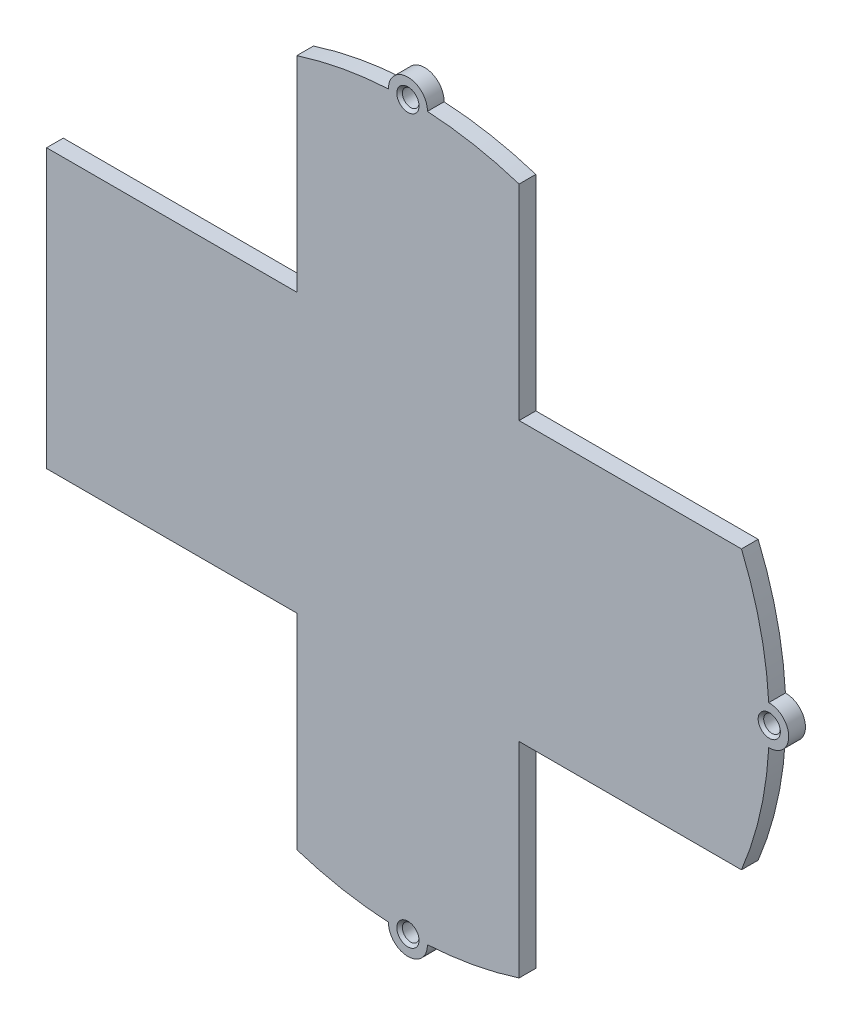
ISO-10303-21;
HEADER;
FILE_DESCRIPTION(('STEP AP214'),'2;1');
FILE_NAME('part.step','',(''),(''),'','','');
FILE_SCHEMA(('AUTOMOTIVE_DESIGN { 1 0 10303 214 1 1 1 1 }'));
ENDSEC;
DATA;
#1=APPLICATION_CONTEXT('core data for automotive mechanical design processes');
#2=APPLICATION_PROTOCOL_DEFINITION('international standard','automotive_design',2000,#1);
#3=PRODUCT_CONTEXT('',#1,'mechanical');
#4=PRODUCT('Part','Part','',(#3));
#5=PRODUCT_RELATED_PRODUCT_CATEGORY('part','',(#4));
#6=PRODUCT_DEFINITION_FORMATION('','',#4);
#7=PRODUCT_DEFINITION_CONTEXT('part definition',#1,'design');
#8=PRODUCT_DEFINITION('design','',#6,#7);
#9=PRODUCT_DEFINITION_SHAPE('','',#8);
#10=(LENGTH_UNIT() NAMED_UNIT(*) SI_UNIT(.MILLI.,.METRE.));
#11=(NAMED_UNIT(*) PLANE_ANGLE_UNIT() SI_UNIT($,.RADIAN.));
#12=(NAMED_UNIT(*) SI_UNIT($,.STERADIAN.) SOLID_ANGLE_UNIT());
#13=UNCERTAINTY_MEASURE_WITH_UNIT(LENGTH_MEASURE(1.E-05),#10,'distance_accuracy_value','');
#14=(GEOMETRIC_REPRESENTATION_CONTEXT(3) GLOBAL_UNCERTAINTY_ASSIGNED_CONTEXT((#13)) GLOBAL_UNIT_ASSIGNED_CONTEXT((#10,
#11,#12)) REPRESENTATION_CONTEXT('',''));
#15=CARTESIAN_POINT('',(0.,0.,0.));
#16=DIRECTION('',(0.,0.,1.));
#17=DIRECTION('',(1.,0.,0.));
#18=AXIS2_PLACEMENT_3D('',#15,#16,#17);
#19=CARTESIAN_POINT('',(0.,0.,3.));
#20=DIRECTION('',(0.,0.,-1.));
#21=DIRECTION('',(-1.,0.,0.));
#22=AXIS2_PLACEMENT_3D('',#19,#20,#21);
#23=CYLINDRICAL_SURFACE('',#22,65.);
#24=CARTESIAN_POINT('',(0.,0.,0.));
#25=DIRECTION('',(0.,0.,1.));
#26=DIRECTION('',(1.,0.,0.));
#27=AXIS2_PLACEMENT_3D('',#24,#25,#26);
#28=CIRCLE('',#27,65.);
#29=CARTESIAN_POINT('',(-20.,-61.8465843842649,0.));
#30=VERTEX_POINT('',#29);
#31=CARTESIAN_POINT('',(-3.4987312789253,-64.9057692307692,0.));
#32=VERTEX_POINT('',#31);
#33=EDGE_CURVE('E264',#30,#32,#28,.T.);
#34=ORIENTED_EDGE('',*,*,#33,.T.);
#35=DIRECTION('',(0.,0.,1.));
#36=VECTOR('',#35,1.);
#37=CARTESIAN_POINT('',(-3.4987312789253,-64.9057692307692,1.5));
#38=LINE('',#37,#36);
#39=CARTESIAN_POINT('',(-3.4987312789253,-64.9057692307692,3.));
#40=VERTEX_POINT('',#39);
#41=EDGE_CURVE('E214',#32,#40,#38,.T.);
#42=ORIENTED_EDGE('',*,*,#41,.T.);
#43=CARTESIAN_POINT('',(0.,0.,3.));
#44=DIRECTION('',(0.,0.,1.));
#45=DIRECTION('',(1.,0.,0.));
#46=AXIS2_PLACEMENT_3D('',#43,#44,#45);
#47=CIRCLE('',#46,65.);
#48=CARTESIAN_POINT('',(-20.,-61.8465843842649,3.));
#49=VERTEX_POINT('',#48);
#50=EDGE_CURVE('E242',#49,#40,#47,.T.);
#51=ORIENTED_EDGE('',*,*,#50,.F.);
#52=DIRECTION('',(0.,0.,-1.));
#53=VECTOR('',#52,1.);
#54=CARTESIAN_POINT('',(-20.,-61.8465843842649,3.));
#55=LINE('',#54,#53);
#56=EDGE_CURVE('E308',#49,#30,#55,.T.);
#57=ORIENTED_EDGE('',*,*,#56,.T.);
#58=EDGE_LOOP('',(#34,#42,#51,#57));
#59=FACE_BOUND('',#58,.T.);
#60=ADVANCED_FACE('F45',(#59),#23,.T.);
#61=CARTESIAN_POINT('',(0.,0.,3.));
#62=DIRECTION('',(0.,0.,-1.));
#63=DIRECTION('',(-1.,0.,0.));
#64=AXIS2_PLACEMENT_3D('',#61,#62,#63);
#65=CYLINDRICAL_SURFACE('',#64,65.);
#66=CARTESIAN_POINT('',(0.,0.,0.));
#67=DIRECTION('',(0.,0.,1.));
#68=DIRECTION('',(1.,0.,0.));
#69=AXIS2_PLACEMENT_3D('',#66,#67,#68);
#70=CIRCLE('',#69,65.);
#71=CARTESIAN_POINT('',(20.,61.8465843842649,0.));
#72=VERTEX_POINT('',#71);
#73=CARTESIAN_POINT('',(3.49873127892529,64.9057692307692,0.));
#74=VERTEX_POINT('',#73);
#75=EDGE_CURVE('E280',#72,#74,#70,.T.);
#76=ORIENTED_EDGE('',*,*,#75,.T.);
#77=DIRECTION('',(0.,0.,1.));
#78=VECTOR('',#77,1.);
#79=CARTESIAN_POINT('',(3.49873127892529,64.9057692307692,1.5));
#80=LINE('',#79,#78);
#81=CARTESIAN_POINT('',(3.49873127892529,64.9057692307692,3.));
#82=VERTEX_POINT('',#81);
#83=EDGE_CURVE('E223',#74,#82,#80,.T.);
#84=ORIENTED_EDGE('',*,*,#83,.T.);
#85=CARTESIAN_POINT('',(0.,0.,3.));
#86=DIRECTION('',(0.,0.,1.));
#87=DIRECTION('',(1.,0.,0.));
#88=AXIS2_PLACEMENT_3D('',#85,#86,#87);
#89=CIRCLE('',#88,65.);
#90=CARTESIAN_POINT('',(20.,61.8465843842649,3.));
#91=VERTEX_POINT('',#90);
#92=EDGE_CURVE('E257',#91,#82,#89,.T.);
#93=ORIENTED_EDGE('',*,*,#92,.F.);
#94=DIRECTION('',(0.,0.,-1.));
#95=VECTOR('',#94,1.);
#96=CARTESIAN_POINT('',(20.,61.8465843842649,3.));
#97=LINE('',#96,#95);
#98=EDGE_CURVE('E290',#91,#72,#97,.T.);
#99=ORIENTED_EDGE('',*,*,#98,.T.);
#100=EDGE_LOOP('',(#76,#84,#93,#99));
#101=FACE_BOUND('',#100,.T.);
#102=ADVANCED_FACE('F346',(#101),#65,.T.);
#103=CARTESIAN_POINT('',(0.,0.,3.));
#104=DIRECTION('',(0.,0.,-1.));
#105=DIRECTION('',(-1.,0.,0.));
#106=AXIS2_PLACEMENT_3D('',#103,#104,#105);
#107=CYLINDRICAL_SURFACE('',#106,65.);
#108=CARTESIAN_POINT('',(0.,0.,0.));
#109=DIRECTION('',(0.,0.,1.));
#110=DIRECTION('',(1.,0.,0.));
#111=AXIS2_PLACEMENT_3D('',#108,#109,#110);
#112=CIRCLE('',#111,65.);
#113=CARTESIAN_POINT('',(60.,-25.,0.));
#114=VERTEX_POINT('',#113);
#115=CARTESIAN_POINT('',(64.9057692307692,-3.49873127892529,0.));
#116=VERTEX_POINT('',#115);
#117=EDGE_CURVE('E272',#114,#116,#112,.T.);
#118=ORIENTED_EDGE('',*,*,#117,.T.);
#119=DIRECTION('',(0.,0.,1.));
#120=VECTOR('',#119,1.);
#121=CARTESIAN_POINT('',(64.9057692307692,-3.49873127892529,1.5));
#122=LINE('',#121,#120);
#123=CARTESIAN_POINT('',(64.9057692307692,-3.49873127892529,3.));
#124=VERTEX_POINT('',#123);
#125=EDGE_CURVE('E233',#116,#124,#122,.T.);
#126=ORIENTED_EDGE('',*,*,#125,.T.);
#127=CARTESIAN_POINT('',(0.,0.,3.));
#128=DIRECTION('',(0.,0.,1.));
#129=DIRECTION('',(1.,0.,0.));
#130=AXIS2_PLACEMENT_3D('',#127,#128,#129);
#131=CIRCLE('',#130,65.);
#132=CARTESIAN_POINT('',(60.,-25.,3.));
#133=VERTEX_POINT('',#132);
#134=EDGE_CURVE('E249',#133,#124,#131,.T.);
#135=ORIENTED_EDGE('',*,*,#134,.F.);
#136=DIRECTION('',(0.,0.,-1.));
#137=VECTOR('',#136,1.);
#138=CARTESIAN_POINT('',(60.,-25.,3.));
#139=LINE('',#138,#137);
#140=EDGE_CURVE('E299',#133,#114,#139,.T.);
#141=ORIENTED_EDGE('',*,*,#140,.T.);
#142=EDGE_LOOP('',(#118,#126,#135,#141));
#143=FACE_BOUND('',#142,.T.);
#144=ADVANCED_FACE('F354',(#143),#107,.T.);
#145=CARTESIAN_POINT('',(-60.,-25.,3.));
#146=DIRECTION('',(0.,1.,0.));
#147=DIRECTION('',(0.,0.,1.));
#148=AXIS2_PLACEMENT_3D('',#145,#146,#147);
#149=PLANE('',#148);
#150=DIRECTION('',(1.,0.,0.));
#151=VECTOR('',#150,1.);
#152=CARTESIAN_POINT('',(-60.,-25.,0.));
#153=LINE('',#152,#151);
#154=CARTESIAN_POINT('',(-65.,-25.,0.));
#155=VERTEX_POINT('',#154);
#156=CARTESIAN_POINT('',(-20.,-25.,0.));
#157=VERTEX_POINT('',#156);
#158=EDGE_CURVE('E236',#155,#157,#153,.T.);
#159=ORIENTED_EDGE('',*,*,#158,.T.);
#160=DIRECTION('',(0.,0.,-1.));
#161=VECTOR('',#160,1.);
#162=CARTESIAN_POINT('',(-20.,-25.,3.));
#163=LINE('',#162,#161);
#164=CARTESIAN_POINT('',(-20.,-25.,3.));
#165=VERTEX_POINT('',#164);
#166=EDGE_CURVE('E311',#165,#157,#163,.T.);
#167=ORIENTED_EDGE('',*,*,#166,.F.);
#168=DIRECTION('',(1.,0.,0.));
#169=VECTOR('',#168,1.);
#170=CARTESIAN_POINT('',(-60.,-25.,3.));
#171=LINE('',#170,#169);
#172=CARTESIAN_POINT('',(-65.,-25.,3.));
#173=VERTEX_POINT('',#172);
#174=EDGE_CURVE('E237',#173,#165,#171,.T.);
#175=ORIENTED_EDGE('',*,*,#174,.F.);
#176=DIRECTION('',(0.,0.,1.));
#177=VECTOR('',#176,1.);
#178=CARTESIAN_POINT('',(-65.,-25.,0.));
#179=LINE('',#178,#177);
#180=EDGE_CURVE('E188',#155,#173,#179,.T.);
#181=ORIENTED_EDGE('',*,*,#180,.F.);
#182=EDGE_LOOP('',(#159,#167,#175,#181));
#183=FACE_BOUND('',#182,.T.);
#184=ADVANCED_FACE('F372',(#183),#149,.F.);
#185=CARTESIAN_POINT('',(-20.,-25.,3.));
#186=DIRECTION('',(1.,0.,0.));
#187=DIRECTION('',(0.,0.,-1.));
#188=AXIS2_PLACEMENT_3D('',#185,#186,#187);
#189=PLANE('',#188);
#190=DIRECTION('',(0.,-1.,0.));
#191=VECTOR('',#190,1.);
#192=CARTESIAN_POINT('',(-20.,-25.,0.));
#193=LINE('',#192,#191);
#194=EDGE_CURVE('E261',#157,#30,#193,.T.);
#195=ORIENTED_EDGE('',*,*,#194,.T.);
#196=ORIENTED_EDGE('',*,*,#56,.F.);
#197=DIRECTION('',(0.,-1.,0.));
#198=VECTOR('',#197,1.);
#199=CARTESIAN_POINT('',(-20.,-25.,3.));
#200=LINE('',#199,#198);
#201=EDGE_CURVE('E239',#165,#49,#200,.T.);
#202=ORIENTED_EDGE('',*,*,#201,.F.);
#203=ORIENTED_EDGE('',*,*,#166,.T.);
#204=EDGE_LOOP('',(#195,#196,#202,#203));
#205=FACE_BOUND('',#204,.T.);
#206=ADVANCED_FACE('F362',(#205),#189,.F.);
#207=CARTESIAN_POINT('',(3.49873127892516,-64.9057692307692,3.));
#208=VERTEX_POINT('',#207);
#209=CARTESIAN_POINT('',(20.,-61.8465843842649,3.));
#210=VERTEX_POINT('',#209);
#211=EDGE_CURVE('E241',#208,#210,#47,.T.);
#212=ORIENTED_EDGE('',*,*,#211,.F.);
#213=DIRECTION('',(0.,0.,1.));
#214=VECTOR('',#213,1.);
#215=CARTESIAN_POINT('',(3.49873127892528,-64.9057692307692,1.5));
#216=LINE('',#215,#214);
#217=CARTESIAN_POINT('',(3.49873127892528,-64.9057692307692,0.));
#218=VERTEX_POINT('',#217);
#219=EDGE_CURVE('E210',#208,#218,#216,.F.);
#220=ORIENTED_EDGE('',*,*,#219,.T.);
#221=CARTESIAN_POINT('',(20.,-61.8465843842649,0.));
#222=VERTEX_POINT('',#221);
#223=EDGE_CURVE('E263',#218,#222,#28,.T.);
#224=ORIENTED_EDGE('',*,*,#223,.T.);
#225=DIRECTION('',(0.,0.,-1.));
#226=VECTOR('',#225,1.);
#227=CARTESIAN_POINT('',(20.,-61.8465843842649,3.));
#228=LINE('',#227,#226);
#229=EDGE_CURVE('E305',#210,#222,#228,.T.);
#230=ORIENTED_EDGE('',*,*,#229,.F.);
#231=EDGE_LOOP('',(#212,#220,#224,#230));
#232=FACE_BOUND('',#231,.T.);
#233=ADVANCED_FACE('F349',(#232),#23,.T.);
#234=CARTESIAN_POINT('',(20.,-25.,3.));
#235=DIRECTION('',(-1.,0.,0.));
#236=DIRECTION('',(0.,-1.,0.));
#237=AXIS2_PLACEMENT_3D('',#234,#235,#236);
#238=PLANE('',#237);
#239=DIRECTION('',(0.,1.,0.));
#240=VECTOR('',#239,1.);
#241=CARTESIAN_POINT('',(20.,-25.,0.));
#242=LINE('',#241,#240);
#243=CARTESIAN_POINT('',(20.,-25.,0.));
#244=VERTEX_POINT('',#243);
#245=EDGE_CURVE('E267',#222,#244,#242,.T.);
#246=ORIENTED_EDGE('',*,*,#245,.T.);
#247=DIRECTION('',(0.,0.,-1.));
#248=VECTOR('',#247,1.);
#249=CARTESIAN_POINT('',(20.,-25.,3.));
#250=LINE('',#249,#248);
#251=CARTESIAN_POINT('',(20.,-25.,3.));
#252=VERTEX_POINT('',#251);
#253=EDGE_CURVE('E302',#252,#244,#250,.T.);
#254=ORIENTED_EDGE('',*,*,#253,.F.);
#255=DIRECTION('',(0.,1.,0.));
#256=VECTOR('',#255,1.);
#257=CARTESIAN_POINT('',(20.,-25.,3.));
#258=LINE('',#257,#256);
#259=EDGE_CURVE('E244',#210,#252,#258,.T.);
#260=ORIENTED_EDGE('',*,*,#259,.F.);
#261=ORIENTED_EDGE('',*,*,#229,.T.);
#262=EDGE_LOOP('',(#246,#254,#260,#261));
#263=FACE_BOUND('',#262,.T.);
#264=ADVANCED_FACE('F361',(#263),#238,.F.);
#265=CARTESIAN_POINT('',(20.,-25.,3.));
#266=DIRECTION('',(0.,1.,0.));
#267=DIRECTION('',(0.,0.,1.));
#268=AXIS2_PLACEMENT_3D('',#265,#266,#267);
#269=PLANE('',#268);
#270=DIRECTION('',(1.,0.,0.));
#271=VECTOR('',#270,1.);
#272=CARTESIAN_POINT('',(20.,-25.,0.));
#273=LINE('',#272,#271);
#274=EDGE_CURVE('E269',#244,#114,#273,.T.);
#275=ORIENTED_EDGE('',*,*,#274,.T.);
#276=ORIENTED_EDGE('',*,*,#140,.F.);
#277=DIRECTION('',(1.,0.,0.));
#278=VECTOR('',#277,1.);
#279=CARTESIAN_POINT('',(20.,-25.,3.));
#280=LINE('',#279,#278);
#281=EDGE_CURVE('E246',#252,#133,#280,.T.);
#282=ORIENTED_EDGE('',*,*,#281,.F.);
#283=ORIENTED_EDGE('',*,*,#253,.T.);
#284=EDGE_LOOP('',(#275,#276,#282,#283));
#285=FACE_BOUND('',#284,.T.);
#286=ADVANCED_FACE('F369',(#285),#269,.F.);
#287=CARTESIAN_POINT('',(64.9057692307692,3.49873127892542,3.));
#288=VERTEX_POINT('',#287);
#289=CARTESIAN_POINT('',(60.,25.,3.));
#290=VERTEX_POINT('',#289);
#291=EDGE_CURVE('E248',#288,#290,#131,.T.);
#292=ORIENTED_EDGE('',*,*,#291,.F.);
#293=DIRECTION('',(0.,0.,1.));
#294=VECTOR('',#293,1.);
#295=CARTESIAN_POINT('',(64.9057692307692,3.49873127892529,1.5));
#296=LINE('',#295,#294);
#297=CARTESIAN_POINT('',(64.9057692307692,3.49873127892529,0.));
#298=VERTEX_POINT('',#297);
#299=EDGE_CURVE('E229',#288,#298,#296,.F.);
#300=ORIENTED_EDGE('',*,*,#299,.T.);
#301=CARTESIAN_POINT('',(60.,25.,0.));
#302=VERTEX_POINT('',#301);
#303=EDGE_CURVE('E271',#298,#302,#112,.T.);
#304=ORIENTED_EDGE('',*,*,#303,.T.);
#305=DIRECTION('',(0.,0.,-1.));
#306=VECTOR('',#305,1.);
#307=CARTESIAN_POINT('',(60.,25.,3.));
#308=LINE('',#307,#306);
#309=EDGE_CURVE('E296',#290,#302,#308,.T.);
#310=ORIENTED_EDGE('',*,*,#309,.F.);
#311=EDGE_LOOP('',(#292,#300,#304,#310));
#312=FACE_BOUND('',#311,.T.);
#313=ADVANCED_FACE('F395',(#312),#107,.T.);
#314=CARTESIAN_POINT('',(20.,25.,3.));
#315=DIRECTION('',(0.,-1.,0.));
#316=DIRECTION('',(1.,0.,0.));
#317=AXIS2_PLACEMENT_3D('',#314,#315,#316);
#318=PLANE('',#317);
#319=DIRECTION('',(-1.,0.,0.));
#320=VECTOR('',#319,1.);
#321=CARTESIAN_POINT('',(20.,25.,0.));
#322=LINE('',#321,#320);
#323=CARTESIAN_POINT('',(20.,25.,0.));
#324=VERTEX_POINT('',#323);
#325=EDGE_CURVE('E275',#302,#324,#322,.T.);
#326=ORIENTED_EDGE('',*,*,#325,.T.);
#327=DIRECTION('',(0.,0.,-1.));
#328=VECTOR('',#327,1.);
#329=CARTESIAN_POINT('',(20.,25.,3.));
#330=LINE('',#329,#328);
#331=CARTESIAN_POINT('',(20.,25.,3.));
#332=VERTEX_POINT('',#331);
#333=EDGE_CURVE('E293',#332,#324,#330,.T.);
#334=ORIENTED_EDGE('',*,*,#333,.F.);
#335=DIRECTION('',(-1.,0.,0.));
#336=VECTOR('',#335,1.);
#337=CARTESIAN_POINT('',(20.,25.,3.));
#338=LINE('',#337,#336);
#339=EDGE_CURVE('E252',#290,#332,#338,.T.);
#340=ORIENTED_EDGE('',*,*,#339,.F.);
#341=ORIENTED_EDGE('',*,*,#309,.T.);
#342=EDGE_LOOP('',(#326,#334,#340,#341));
#343=FACE_BOUND('',#342,.T.);
#344=ADVANCED_FACE('F400',(#343),#318,.F.);
#345=CARTESIAN_POINT('',(20.,61.8465843842649,3.));
#346=DIRECTION('',(-1.,0.,0.));
#347=DIRECTION('',(0.,-1.,0.));
#348=AXIS2_PLACEMENT_3D('',#345,#346,#347);
#349=PLANE('',#348);
#350=DIRECTION('',(0.,1.,0.));
#351=VECTOR('',#350,1.);
#352=CARTESIAN_POINT('',(20.,61.8465843842649,0.));
#353=LINE('',#352,#351);
#354=EDGE_CURVE('E277',#324,#72,#353,.T.);
#355=ORIENTED_EDGE('',*,*,#354,.T.);
#356=ORIENTED_EDGE('',*,*,#98,.F.);
#357=DIRECTION('',(0.,1.,0.));
#358=VECTOR('',#357,1.);
#359=CARTESIAN_POINT('',(20.,61.8465843842649,3.));
#360=LINE('',#359,#358);
#361=EDGE_CURVE('E254',#332,#91,#360,.T.);
#362=ORIENTED_EDGE('',*,*,#361,.F.);
#363=ORIENTED_EDGE('',*,*,#333,.T.);
#364=EDGE_LOOP('',(#355,#356,#362,#363));
#365=FACE_BOUND('',#364,.T.);
#366=ADVANCED_FACE('F405',(#365),#349,.F.);
#367=CARTESIAN_POINT('',(-3.49873127892517,64.9057692307692,3.));
#368=VERTEX_POINT('',#367);
#369=CARTESIAN_POINT('',(-20.,61.8465843842649,3.));
#370=VERTEX_POINT('',#369);
#371=EDGE_CURVE('E256',#368,#370,#89,.T.);
#372=ORIENTED_EDGE('',*,*,#371,.F.);
#373=DIRECTION('',(0.,0.,1.));
#374=VECTOR('',#373,1.);
#375=CARTESIAN_POINT('',(-3.49873127892528,64.9057692307692,1.5));
#376=LINE('',#375,#374);
#377=CARTESIAN_POINT('',(-3.49873127892528,64.9057692307692,0.));
#378=VERTEX_POINT('',#377);
#379=EDGE_CURVE('E219',#368,#378,#376,.F.);
#380=ORIENTED_EDGE('',*,*,#379,.T.);
#381=CARTESIAN_POINT('',(-20.,61.8465843842649,0.));
#382=VERTEX_POINT('',#381);
#383=EDGE_CURVE('E279',#378,#382,#70,.T.);
#384=ORIENTED_EDGE('',*,*,#383,.T.);
#385=DIRECTION('',(0.,0.,-1.));
#386=VECTOR('',#385,1.);
#387=CARTESIAN_POINT('',(-20.,61.8465843842649,3.));
#388=LINE('',#387,#386);
#389=EDGE_CURVE('E287',#370,#382,#388,.T.);
#390=ORIENTED_EDGE('',*,*,#389,.F.);
#391=EDGE_LOOP('',(#372,#380,#384,#390));
#392=FACE_BOUND('',#391,.T.);
#393=ADVANCED_FACE('F357',(#392),#65,.T.);
#394=CARTESIAN_POINT('',(-20.,61.8465843842649,3.));
#395=DIRECTION('',(1.,0.,0.));
#396=DIRECTION('',(0.,1.,0.));
#397=AXIS2_PLACEMENT_3D('',#394,#395,#396);
#398=PLANE('',#397);
#399=DIRECTION('',(0.,-1.,0.));
#400=VECTOR('',#399,1.);
#401=CARTESIAN_POINT('',(-20.,61.8465843842649,0.));
#402=LINE('',#401,#400);
#403=CARTESIAN_POINT('',(-20.,25.,0.));
#404=VERTEX_POINT('',#403);
#405=EDGE_CURVE('E283',#382,#404,#402,.T.);
#406=ORIENTED_EDGE('',*,*,#405,.T.);
#407=DIRECTION('',(0.,0.,-1.));
#408=VECTOR('',#407,1.);
#409=CARTESIAN_POINT('',(-20.,25.,3.));
#410=LINE('',#409,#408);
#411=CARTESIAN_POINT('',(-20.,25.,3.));
#412=VERTEX_POINT('',#411);
#413=EDGE_CURVE('E179',#412,#404,#410,.T.);
#414=ORIENTED_EDGE('',*,*,#413,.F.);
#415=DIRECTION('',(0.,-1.,0.));
#416=VECTOR('',#415,1.);
#417=CARTESIAN_POINT('',(-20.,61.8465843842649,3.));
#418=LINE('',#417,#416);
#419=EDGE_CURVE('E174',#370,#412,#418,.T.);
#420=ORIENTED_EDGE('',*,*,#419,.F.);
#421=ORIENTED_EDGE('',*,*,#389,.T.);
#422=EDGE_LOOP('',(#406,#414,#420,#421));
#423=FACE_BOUND('',#422,.T.);
#424=ADVANCED_FACE('F419',(#423),#398,.F.);
#425=CARTESIAN_POINT('',(-60.,25.,3.));
#426=DIRECTION('',(0.,-1.,0.));
#427=DIRECTION('',(1.,0.,0.));
#428=AXIS2_PLACEMENT_3D('',#425,#426,#427);
#429=PLANE('',#428);
#430=DIRECTION('',(-1.,0.,0.));
#431=VECTOR('',#430,1.);
#432=CARTESIAN_POINT('',(-60.,25.,0.));
#433=LINE('',#432,#431);
#434=CARTESIAN_POINT('',(-65.,25.,0.));
#435=VERTEX_POINT('',#434);
#436=EDGE_CURVE('E193',#404,#435,#433,.T.);
#437=ORIENTED_EDGE('',*,*,#436,.T.);
#438=DIRECTION('',(0.,0.,1.));
#439=VECTOR('',#438,1.);
#440=CARTESIAN_POINT('',(-65.,25.,0.));
#441=LINE('',#440,#439);
#442=CARTESIAN_POINT('',(-65.,25.,3.));
#443=VERTEX_POINT('',#442);
#444=EDGE_CURVE('E186',#435,#443,#441,.T.);
#445=ORIENTED_EDGE('',*,*,#444,.T.);
#446=DIRECTION('',(-1.,0.,0.));
#447=VECTOR('',#446,1.);
#448=CARTESIAN_POINT('',(-60.,25.,3.));
#449=LINE('',#448,#447);
#450=EDGE_CURVE('E169',#412,#443,#449,.T.);
#451=ORIENTED_EDGE('',*,*,#450,.F.);
#452=ORIENTED_EDGE('',*,*,#413,.T.);
#453=EDGE_LOOP('',(#437,#445,#451,#452));
#454=FACE_BOUND('',#453,.T.);
#455=ADVANCED_FACE('F191',(#454),#429,.F.);
#456=CARTESIAN_POINT('',(0.,0.,3.));
#457=DIRECTION('',(0.,0.,1.));
#458=DIRECTION('',(1.,0.,0.));
#459=AXIS2_PLACEMENT_3D('',#456,#457,#458);
#460=PLANE('',#459);
#461=CARTESIAN_POINT('',(0.,65.,3.));
#462=DIRECTION('',(0.,0.,1.));
#463=DIRECTION('',(1.,0.,0.));
#464=AXIS2_PLACEMENT_3D('',#461,#462,#463);
#465=CIRCLE('',#464,2.);
#466=CARTESIAN_POINT('',(2.00000000000001,65.,3.));
#467=VERTEX_POINT('',#466);
#468=EDGE_CURVE('E323',#467,#467,#465,.F.);
#469=ORIENTED_EDGE('',*,*,#468,.T.);
#470=EDGE_LOOP('',(#469));
#471=FACE_BOUND('',#470,.T.);
#472=CARTESIAN_POINT('',(65.,0.,3.));
#473=DIRECTION('',(0.,0.,1.));
#474=DIRECTION('',(1.,0.,0.));
#475=AXIS2_PLACEMENT_3D('',#472,#473,#474);
#476=CIRCLE('',#475,2.00000000000003);
#477=CARTESIAN_POINT('',(67.,0.,3.));
#478=VERTEX_POINT('',#477);
#479=EDGE_CURVE('E320',#478,#478,#476,.F.);
#480=ORIENTED_EDGE('',*,*,#479,.T.);
#481=EDGE_LOOP('',(#480));
#482=FACE_BOUND('',#481,.T.);
#483=CARTESIAN_POINT('',(0.,-65.,3.));
#484=DIRECTION('',(0.,0.,1.));
#485=DIRECTION('',(1.,0.,0.));
#486=AXIS2_PLACEMENT_3D('',#483,#484,#485);
#487=CIRCLE('',#486,2.);
#488=CARTESIAN_POINT('',(1.99999999999999,-65.,3.));
#489=VERTEX_POINT('',#488);
#490=EDGE_CURVE('E317',#489,#489,#487,.F.);
#491=ORIENTED_EDGE('',*,*,#490,.T.);
#492=EDGE_LOOP('',(#491));
#493=FACE_BOUND('',#492,.T.);
#494=ORIENTED_EDGE('',*,*,#50,.T.);
#495=CARTESIAN_POINT('',(0.,-65.,3.));
#496=DIRECTION('',(0.,0.,1.));
#497=DIRECTION('',(1.,0.,0.));
#498=AXIS2_PLACEMENT_3D('',#495,#496,#497);
#499=CIRCLE('',#498,3.5);
#500=EDGE_CURVE('E61',#40,#208,#499,.T.);
#501=ORIENTED_EDGE('',*,*,#500,.T.);
#502=ORIENTED_EDGE('',*,*,#211,.T.);
#503=ORIENTED_EDGE('',*,*,#259,.T.);
#504=ORIENTED_EDGE('',*,*,#281,.T.);
#505=ORIENTED_EDGE('',*,*,#134,.T.);
#506=CARTESIAN_POINT('',(65.,0.,3.));
#507=DIRECTION('',(0.,0.,1.));
#508=DIRECTION('',(1.,0.,0.));
#509=AXIS2_PLACEMENT_3D('',#506,#507,#508);
#510=CIRCLE('',#509,3.50000000000001);
#511=EDGE_CURVE('E226',#124,#288,#510,.T.);
#512=ORIENTED_EDGE('',*,*,#511,.T.);
#513=ORIENTED_EDGE('',*,*,#291,.T.);
#514=ORIENTED_EDGE('',*,*,#339,.T.);
#515=ORIENTED_EDGE('',*,*,#361,.T.);
#516=ORIENTED_EDGE('',*,*,#92,.T.);
#517=CARTESIAN_POINT('',(0.,65.,3.));
#518=DIRECTION('',(0.,0.,1.));
#519=DIRECTION('',(1.,0.,0.));
#520=AXIS2_PLACEMENT_3D('',#517,#518,#519);
#521=CIRCLE('',#520,3.5);
#522=EDGE_CURVE('E68',#82,#368,#521,.T.);
#523=ORIENTED_EDGE('',*,*,#522,.T.);
#524=ORIENTED_EDGE('',*,*,#371,.T.);
#525=ORIENTED_EDGE('',*,*,#419,.T.);
#526=ORIENTED_EDGE('',*,*,#450,.T.);
#527=DIRECTION('',(0.,-1.,0.));
#528=VECTOR('',#527,1.);
#529=CARTESIAN_POINT('',(-65.,0.,3.));
#530=LINE('',#529,#528);
#531=EDGE_CURVE('E172',#443,#173,#530,.T.);
#532=ORIENTED_EDGE('',*,*,#531,.T.);
#533=ORIENTED_EDGE('',*,*,#174,.T.);
#534=ORIENTED_EDGE('',*,*,#201,.T.);
#535=EDGE_LOOP('',(#494,#501,#502,#503,#504,#505,#512,#513,#514,#515,#516,#523,#524,#525,#526,
#532,#533,#534));
#536=FACE_BOUND('',#535,.T.);
#537=ADVANCED_FACE('F171',(#471,#482,#493,#536),#460,.T.);
#538=CARTESIAN_POINT('',(0.,0.,0.));
#539=DIRECTION('',(0.,0.,1.));
#540=DIRECTION('',(1.,0.,0.));
#541=AXIS2_PLACEMENT_3D('',#538,#539,#540);
#542=PLANE('',#541);
#543=CARTESIAN_POINT('',(0.,65.,0.));
#544=DIRECTION('',(0.,0.,1.));
#545=DIRECTION('',(1.,0.,0.));
#546=AXIS2_PLACEMENT_3D('',#543,#544,#545);
#547=CIRCLE('',#546,1.5);
#548=CARTESIAN_POINT('',(1.5,65.,0.));
#549=VERTEX_POINT('',#548);
#550=EDGE_CURVE('E200',#549,#549,#547,.T.);
#551=ORIENTED_EDGE('',*,*,#550,.T.);
#552=EDGE_LOOP('',(#551));
#553=FACE_BOUND('',#552,.T.);
#554=CARTESIAN_POINT('',(65.,0.,0.));
#555=DIRECTION('',(0.,0.,1.));
#556=DIRECTION('',(1.,0.,0.));
#557=AXIS2_PLACEMENT_3D('',#554,#555,#556);
#558=CIRCLE('',#557,1.5);
#559=CARTESIAN_POINT('',(66.5,0.,0.));
#560=VERTEX_POINT('',#559);
#561=EDGE_CURVE('E203',#560,#560,#558,.T.);
#562=ORIENTED_EDGE('',*,*,#561,.T.);
#563=EDGE_LOOP('',(#562));
#564=FACE_BOUND('',#563,.T.);
#565=CARTESIAN_POINT('',(0.,-65.,0.));
#566=DIRECTION('',(0.,0.,1.));
#567=DIRECTION('',(1.,0.,0.));
#568=AXIS2_PLACEMENT_3D('',#565,#566,#567);
#569=CIRCLE('',#568,1.5);
#570=CARTESIAN_POINT('',(1.49999999999999,-65.,0.));
#571=VERTEX_POINT('',#570);
#572=EDGE_CURVE('E199',#571,#571,#569,.T.);
#573=ORIENTED_EDGE('',*,*,#572,.T.);
#574=EDGE_LOOP('',(#573));
#575=FACE_BOUND('',#574,.T.);
#576=ORIENTED_EDGE('',*,*,#223,.F.);
#577=CARTESIAN_POINT('',(0.,-65.,0.));
#578=DIRECTION('',(0.,0.,1.));
#579=DIRECTION('',(1.,0.,0.));
#580=AXIS2_PLACEMENT_3D('',#577,#578,#579);
#581=CIRCLE('',#580,3.5);
#582=EDGE_CURVE('E208',#32,#218,#581,.T.);
#583=ORIENTED_EDGE('',*,*,#582,.F.);
#584=ORIENTED_EDGE('',*,*,#33,.F.);
#585=ORIENTED_EDGE('',*,*,#194,.F.);
#586=ORIENTED_EDGE('',*,*,#158,.F.);
#587=DIRECTION('',(0.,-1.,0.));
#588=VECTOR('',#587,1.);
#589=CARTESIAN_POINT('',(-65.,0.,0.));
#590=LINE('',#589,#588);
#591=EDGE_CURVE('E189',#435,#155,#590,.T.);
#592=ORIENTED_EDGE('',*,*,#591,.F.);
#593=ORIENTED_EDGE('',*,*,#436,.F.);
#594=ORIENTED_EDGE('',*,*,#405,.F.);
#595=ORIENTED_EDGE('',*,*,#383,.F.);
#596=CARTESIAN_POINT('',(0.,65.,0.));
#597=DIRECTION('',(0.,0.,1.));
#598=DIRECTION('',(1.,0.,0.));
#599=AXIS2_PLACEMENT_3D('',#596,#597,#598);
#600=CIRCLE('',#599,3.5);
#601=EDGE_CURVE('E217',#74,#378,#600,.T.);
#602=ORIENTED_EDGE('',*,*,#601,.F.);
#603=ORIENTED_EDGE('',*,*,#75,.F.);
#604=ORIENTED_EDGE('',*,*,#354,.F.);
#605=ORIENTED_EDGE('',*,*,#325,.F.);
#606=ORIENTED_EDGE('',*,*,#303,.F.);
#607=CARTESIAN_POINT('',(65.,0.,0.));
#608=DIRECTION('',(0.,0.,1.));
#609=DIRECTION('',(1.,0.,0.));
#610=AXIS2_PLACEMENT_3D('',#607,#608,#609);
#611=CIRCLE('',#610,3.50000000000001);
#612=EDGE_CURVE('E227',#116,#298,#611,.T.);
#613=ORIENTED_EDGE('',*,*,#612,.F.);
#614=ORIENTED_EDGE('',*,*,#117,.F.);
#615=ORIENTED_EDGE('',*,*,#274,.F.);
#616=ORIENTED_EDGE('',*,*,#245,.F.);
#617=EDGE_LOOP('',(#576,#583,#584,#585,#586,#592,#593,#594,#595,#602,#603,#604,#605,#606,#613,
#614,#615,#616));
#618=FACE_BOUND('',#617,.T.);
#619=ADVANCED_FACE('F413',(#553,#564,#575,#618),#542,.F.);
#620=CARTESIAN_POINT('',(65.,0.,0.));
#621=DIRECTION('',(0.,0.,1.));
#622=DIRECTION('',(1.,0.,0.));
#623=AXIS2_PLACEMENT_3D('',#620,#621,#622);
#624=CYLINDRICAL_SURFACE('',#623,3.50000000000001);
#625=ORIENTED_EDGE('',*,*,#125,.F.);
#626=ORIENTED_EDGE('',*,*,#612,.T.);
#627=ORIENTED_EDGE('',*,*,#299,.F.);
#628=ORIENTED_EDGE('',*,*,#511,.F.);
#629=EDGE_LOOP('',(#625,#626,#627,#628));
#630=FACE_BOUND('',#629,.T.);
#631=ADVANCED_FACE('F391',(#630),#624,.T.);
#632=CARTESIAN_POINT('',(0.,65.,0.));
#633=DIRECTION('',(0.,0.,1.));
#634=DIRECTION('',(1.,0.,0.));
#635=AXIS2_PLACEMENT_3D('',#632,#633,#634);
#636=CYLINDRICAL_SURFACE('',#635,3.5);
#637=ORIENTED_EDGE('',*,*,#83,.F.);
#638=ORIENTED_EDGE('',*,*,#601,.T.);
#639=ORIENTED_EDGE('',*,*,#379,.F.);
#640=ORIENTED_EDGE('',*,*,#522,.F.);
#641=EDGE_LOOP('',(#637,#638,#639,#640));
#642=FACE_BOUND('',#641,.T.);
#643=ADVANCED_FACE('F410',(#642),#636,.T.);
#644=CARTESIAN_POINT('',(0.,-65.,0.));
#645=DIRECTION('',(0.,0.,1.));
#646=DIRECTION('',(1.,0.,0.));
#647=AXIS2_PLACEMENT_3D('',#644,#645,#646);
#648=CYLINDRICAL_SURFACE('',#647,3.5);
#649=ORIENTED_EDGE('',*,*,#41,.F.);
#650=ORIENTED_EDGE('',*,*,#582,.T.);
#651=ORIENTED_EDGE('',*,*,#219,.F.);
#652=ORIENTED_EDGE('',*,*,#500,.F.);
#653=EDGE_LOOP('',(#649,#650,#651,#652));
#654=FACE_BOUND('',#653,.T.);
#655=ADVANCED_FACE('F429',(#654),#648,.T.);
#656=CARTESIAN_POINT('',(0.,-65.,0.));
#657=DIRECTION('',(0.,0.,1.));
#658=DIRECTION('',(1.,0.,0.));
#659=AXIS2_PLACEMENT_3D('',#656,#657,#658);
#660=CYLINDRICAL_SURFACE('',#659,1.5);
#661=CARTESIAN_POINT('',(0.,-65.,2.50000000000002));
#662=DIRECTION('',(0.,0.,1.));
#663=DIRECTION('',(1.,0.,0.));
#664=AXIS2_PLACEMENT_3D('',#661,#662,#663);
#665=CIRCLE('',#664,1.5);
#666=CARTESIAN_POINT('',(1.49999999999999,-65.,2.50000000000002));
#667=VERTEX_POINT('',#666);
#668=EDGE_CURVE('E11',#667,#667,#665,.T.);
#669=ORIENTED_EDGE('',*,*,#668,.T.);
#670=EDGE_LOOP('',(#669));
#671=FACE_BOUND('',#670,.T.);
#672=ORIENTED_EDGE('',*,*,#572,.F.);
#673=EDGE_LOOP('',(#672));
#674=FACE_BOUND('',#673,.T.);
#675=ADVANCED_FACE('F431',(#671,#674),#660,.F.);
#676=CARTESIAN_POINT('',(65.,0.,0.));
#677=DIRECTION('',(0.,0.,1.));
#678=DIRECTION('',(1.,0.,0.));
#679=AXIS2_PLACEMENT_3D('',#676,#677,#678);
#680=CYLINDRICAL_SURFACE('',#679,1.5);
#681=CARTESIAN_POINT('',(65.,0.,2.49999999999999));
#682=DIRECTION('',(0.,0.,1.));
#683=DIRECTION('',(1.,0.,0.));
#684=AXIS2_PLACEMENT_3D('',#681,#682,#683);
#685=CIRCLE('',#684,1.5);
#686=CARTESIAN_POINT('',(66.5,0.,2.49999999999999));
#687=VERTEX_POINT('',#686);
#688=EDGE_CURVE('E54',#687,#687,#685,.T.);
#689=ORIENTED_EDGE('',*,*,#688,.T.);
#690=EDGE_LOOP('',(#689));
#691=FACE_BOUND('',#690,.T.);
#692=ORIENTED_EDGE('',*,*,#561,.F.);
#693=EDGE_LOOP('',(#692));
#694=FACE_BOUND('',#693,.T.);
#695=ADVANCED_FACE('F328',(#691,#694),#680,.F.);
#696=CARTESIAN_POINT('',(0.,65.,0.));
#697=DIRECTION('',(0.,0.,1.));
#698=DIRECTION('',(1.,0.,0.));
#699=AXIS2_PLACEMENT_3D('',#696,#697,#698);
#700=CYLINDRICAL_SURFACE('',#699,1.5);
#701=CARTESIAN_POINT('',(0.,65.,2.50000000000002));
#702=DIRECTION('',(0.,0.,1.));
#703=DIRECTION('',(1.,0.,0.));
#704=AXIS2_PLACEMENT_3D('',#701,#702,#703);
#705=CIRCLE('',#704,1.5);
#706=CARTESIAN_POINT('',(1.5,65.,2.50000000000002));
#707=VERTEX_POINT('',#706);
#708=EDGE_CURVE('E314',#707,#707,#705,.T.);
#709=ORIENTED_EDGE('',*,*,#708,.T.);
#710=EDGE_LOOP('',(#709));
#711=FACE_BOUND('',#710,.T.);
#712=ORIENTED_EDGE('',*,*,#550,.F.);
#713=EDGE_LOOP('',(#712));
#714=FACE_BOUND('',#713,.T.);
#715=ADVANCED_FACE('F340',(#711,#714),#700,.F.);
#716=CARTESIAN_POINT('',(0.,65.,2.50000000000002));
#717=DIRECTION('',(0.,0.,1.));
#718=DIRECTION('',(1.,0.,0.));
#719=AXIS2_PLACEMENT_3D('',#716,#717,#718);
#720=CONICAL_SURFACE('',#719,1.5,0.785398163397471);
#721=ORIENTED_EDGE('',*,*,#468,.F.);
#722=EDGE_LOOP('',(#721));
#723=FACE_BOUND('',#722,.T.);
#724=ORIENTED_EDGE('',*,*,#708,.F.);
#725=EDGE_LOOP('',(#724));
#726=FACE_BOUND('',#725,.T.);
#727=ADVANCED_FACE('F333',(#723,#726),#720,.F.);
#728=CARTESIAN_POINT('',(65.,0.,2.49999999999999));
#729=DIRECTION('',(0.,0.,1.));
#730=DIRECTION('',(1.,0.,0.));
#731=AXIS2_PLACEMENT_3D('',#728,#729,#730);
#732=CONICAL_SURFACE('',#731,1.5,0.78539816339747);
#733=ORIENTED_EDGE('',*,*,#479,.F.);
#734=EDGE_LOOP('',(#733));
#735=FACE_BOUND('',#734,.T.);
#736=ORIENTED_EDGE('',*,*,#688,.F.);
#737=EDGE_LOOP('',(#736));
#738=FACE_BOUND('',#737,.T.);
#739=ADVANCED_FACE('F331',(#735,#738),#732,.F.);
#740=CARTESIAN_POINT('',(0.,-65.,2.50000000000002));
#741=DIRECTION('',(0.,0.,1.));
#742=DIRECTION('',(1.,0.,0.));
#743=AXIS2_PLACEMENT_3D('',#740,#741,#742);
#744=CONICAL_SURFACE('',#743,1.5,0.785398163397471);
#745=ORIENTED_EDGE('',*,*,#490,.F.);
#746=EDGE_LOOP('',(#745));
#747=FACE_BOUND('',#746,.T.);
#748=ORIENTED_EDGE('',*,*,#668,.F.);
#749=EDGE_LOOP('',(#748));
#750=FACE_BOUND('',#749,.T.);
#751=ADVANCED_FACE('F48',(#747,#750),#744,.F.);
#752=CARTESIAN_POINT('',(-65.,0.,0.));
#753=DIRECTION('',(-1.,0.,0.));
#754=DIRECTION('',(0.,0.,1.));
#755=AXIS2_PLACEMENT_3D('',#752,#753,#754);
#756=PLANE('',#755);
#757=ORIENTED_EDGE('',*,*,#531,.F.);
#758=ORIENTED_EDGE('',*,*,#444,.F.);
#759=ORIENTED_EDGE('',*,*,#591,.T.);
#760=ORIENTED_EDGE('',*,*,#180,.T.);
#761=EDGE_LOOP('',(#757,#758,#759,#760));
#762=FACE_BOUND('',#761,.T.);
#763=ADVANCED_FACE('F184',(#762),#756,.T.);
#764=CLOSED_SHELL('',(#60,#102,#144,#184,#206,#233,#264,#286,#313,#344,#366,#393,#424,#455,#537,
#619,#631,#643,#655,#675,#695,#715,#727,#739,#751,#763));
#765=MANIFOLD_SOLID_BREP('B2',#764);
#766=ADVANCED_BREP_SHAPE_REPRESENTATION('',(#18,#765),#14);
#767=SHAPE_DEFINITION_REPRESENTATION(#9,#766);
ENDSEC;
END-ISO-10303-21;
